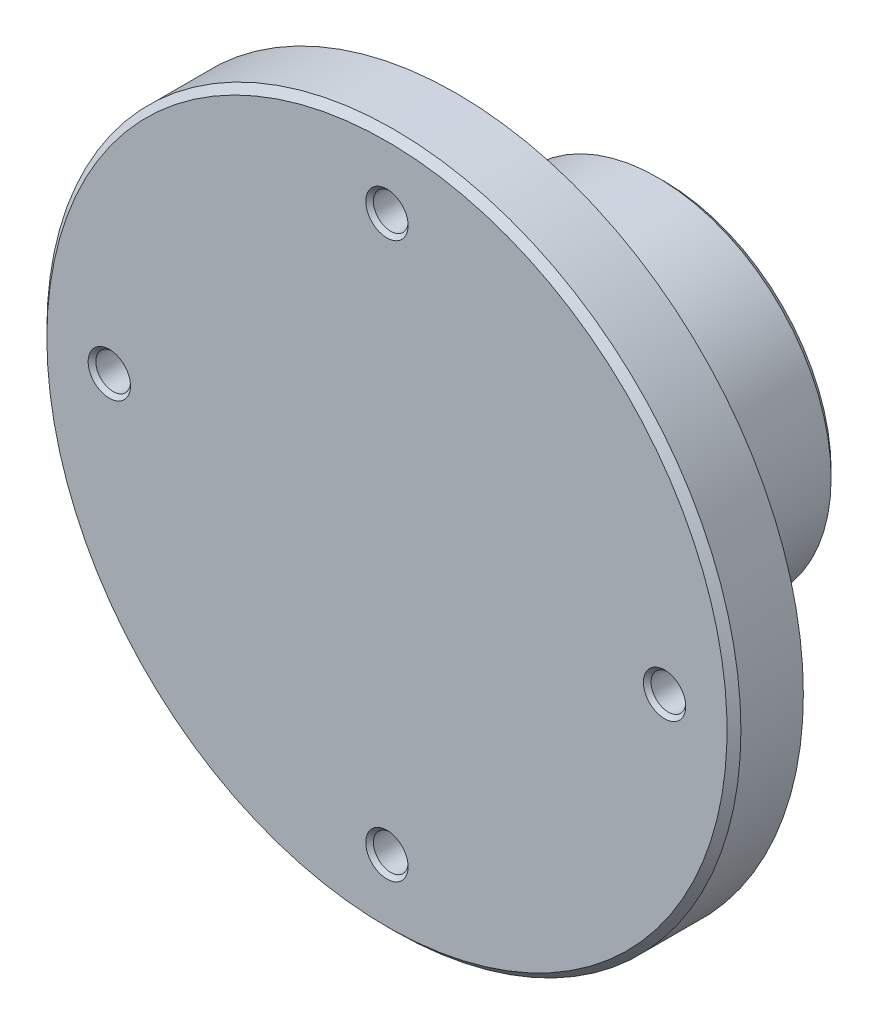
ISO-10303-21;
HEADER;
FILE_DESCRIPTION(('STEP AP214'),'2;1');
FILE_NAME('part.step','',(''),(''),'','','');
FILE_SCHEMA(('AUTOMOTIVE_DESIGN { 1 0 10303 214 1 1 1 1 }'));
ENDSEC;
DATA;
#1=APPLICATION_CONTEXT('core data for automotive mechanical design processes');
#2=APPLICATION_PROTOCOL_DEFINITION('international standard','automotive_design',2000,#1);
#3=PRODUCT_CONTEXT('',#1,'mechanical');
#4=PRODUCT('Part','Part','',(#3));
#5=PRODUCT_RELATED_PRODUCT_CATEGORY('part','',(#4));
#6=PRODUCT_DEFINITION_FORMATION('','',#4);
#7=PRODUCT_DEFINITION_CONTEXT('part definition',#1,'design');
#8=PRODUCT_DEFINITION('design','',#6,#7);
#9=PRODUCT_DEFINITION_SHAPE('','',#8);
#10=(LENGTH_UNIT() NAMED_UNIT(*) SI_UNIT(.MILLI.,.METRE.));
#11=(NAMED_UNIT(*) PLANE_ANGLE_UNIT() SI_UNIT($,.RADIAN.));
#12=(NAMED_UNIT(*) SI_UNIT($,.STERADIAN.) SOLID_ANGLE_UNIT());
#13=UNCERTAINTY_MEASURE_WITH_UNIT(LENGTH_MEASURE(1.E-05),#10,'distance_accuracy_value','');
#14=(GEOMETRIC_REPRESENTATION_CONTEXT(3) GLOBAL_UNCERTAINTY_ASSIGNED_CONTEXT((#13)) GLOBAL_UNIT_ASSIGNED_CONTEXT((#10,
#11,#12)) REPRESENTATION_CONTEXT('',''));
#15=CARTESIAN_POINT('',(0.,0.,0.));
#16=DIRECTION('',(0.,0.,1.));
#17=DIRECTION('',(1.,0.,0.));
#18=AXIS2_PLACEMENT_3D('',#15,#16,#17);
#19=CARTESIAN_POINT('',(0.,0.,0.));
#20=DIRECTION('',(0.,0.,-1.));
#21=DIRECTION('',(-1.,0.,0.));
#22=AXIS2_PLACEMENT_3D('',#19,#20,#21);
#23=PLANE('',#22);
#24=CARTESIAN_POINT('',(0.,0.,0.));
#25=DIRECTION('',(0.,0.,-1.));
#26=DIRECTION('',(-1.,0.,0.));
#27=AXIS2_PLACEMENT_3D('',#24,#25,#26);
#28=CIRCLE('',#27,24.5);
#29=CARTESIAN_POINT('',(-24.5,0.,0.));
#30=VERTEX_POINT('',#29);
#31=EDGE_CURVE('E73',#30,#30,#28,.F.);
#32=ORIENTED_EDGE('',*,*,#31,.T.);
#33=EDGE_LOOP('',(#32));
#34=FACE_BOUND('',#33,.T.);
#35=CARTESIAN_POINT('',(-20.,0.,0.));
#36=DIRECTION('',(0.,0.,1.));
#37=DIRECTION('',(1.,0.,0.));
#38=AXIS2_PLACEMENT_3D('',#35,#36,#37);
#39=CIRCLE('',#38,1.525);
#40=CARTESIAN_POINT('',(-18.475,0.,0.));
#41=VERTEX_POINT('',#40);
#42=EDGE_CURVE('E191',#41,#41,#39,.T.);
#43=ORIENTED_EDGE('',*,*,#42,.F.);
#44=EDGE_LOOP('',(#43));
#45=FACE_BOUND('',#44,.T.);
#46=CARTESIAN_POINT('',(0.,20.,0.));
#47=DIRECTION('',(0.,0.,1.));
#48=DIRECTION('',(1.,0.,0.));
#49=AXIS2_PLACEMENT_3D('',#46,#47,#48);
#50=CIRCLE('',#49,1.525);
#51=CARTESIAN_POINT('',(1.525,20.,0.));
#52=VERTEX_POINT('',#51);
#53=EDGE_CURVE('E91',#52,#52,#50,.T.);
#54=ORIENTED_EDGE('',*,*,#53,.F.);
#55=EDGE_LOOP('',(#54));
#56=FACE_BOUND('',#55,.T.);
#57=CARTESIAN_POINT('',(20.,0.,0.));
#58=DIRECTION('',(0.,0.,1.));
#59=DIRECTION('',(1.,0.,0.));
#60=AXIS2_PLACEMENT_3D('',#57,#58,#59);
#61=CIRCLE('',#60,1.525);
#62=CARTESIAN_POINT('',(21.525,0.,0.));
#63=VERTEX_POINT('',#62);
#64=EDGE_CURVE('E86',#63,#63,#61,.T.);
#65=ORIENTED_EDGE('',*,*,#64,.F.);
#66=EDGE_LOOP('',(#65));
#67=FACE_BOUND('',#66,.T.);
#68=CARTESIAN_POINT('',(0.,-20.,0.));
#69=DIRECTION('',(0.,0.,1.));
#70=DIRECTION('',(1.,0.,0.));
#71=AXIS2_PLACEMENT_3D('',#68,#69,#70);
#72=CIRCLE('',#71,1.525);
#73=CARTESIAN_POINT('',(1.525,-20.,0.));
#74=VERTEX_POINT('',#73);
#75=EDGE_CURVE('E81',#74,#74,#72,.T.);
#76=ORIENTED_EDGE('',*,*,#75,.F.);
#77=EDGE_LOOP('',(#76));
#78=FACE_BOUND('',#77,.T.);
#79=ADVANCED_FACE('F37',(#34,#45,#56,#67,#78),#23,.F.);
#80=CARTESIAN_POINT('',(0.,0.,109.859154929577));
#81=DIRECTION('',(0.,0.,1.));
#82=DIRECTION('',(1.,0.,0.));
#83=AXIS2_PLACEMENT_3D('',#80,#81,#82);
#84=CYLINDRICAL_SURFACE('',#83,25.);
#85=CARTESIAN_POINT('',(0.,0.,-0.500000000000028));
#86=DIRECTION('',(0.,0.,-1.));
#87=DIRECTION('',(-1.,0.,0.));
#88=AXIS2_PLACEMENT_3D('',#85,#86,#87);
#89=CIRCLE('',#88,25.);
#90=CARTESIAN_POINT('',(-25.,0.,-0.500000000000028));
#91=VERTEX_POINT('',#90);
#92=EDGE_CURVE('E95',#91,#91,#89,.T.);
#93=ORIENTED_EDGE('',*,*,#92,.T.);
#94=EDGE_LOOP('',(#93));
#95=FACE_BOUND('',#94,.T.);
#96=CARTESIAN_POINT('',(0.,0.,-5.));
#97=DIRECTION('',(0.,0.,1.));
#98=DIRECTION('',(1.,0.,0.));
#99=AXIS2_PLACEMENT_3D('',#96,#97,#98);
#100=CIRCLE('',#99,25.);
#101=CARTESIAN_POINT('',(25.,0.,-5.));
#102=VERTEX_POINT('',#101);
#103=EDGE_CURVE('E57',#102,#102,#100,.T.);
#104=ORIENTED_EDGE('',*,*,#103,.T.);
#105=EDGE_LOOP('',(#104));
#106=FACE_BOUND('',#105,.T.);
#107=ADVANCED_FACE('F113',(#95,#106),#84,.T.);
#108=CARTESIAN_POINT('',(0.,25.,-5.));
#109=DIRECTION('',(0.,0.,1.));
#110=DIRECTION('',(1.,0.,0.));
#111=AXIS2_PLACEMENT_3D('',#108,#109,#110);
#112=PLANE('',#111);
#113=CARTESIAN_POINT('',(-20.,0.,-5.));
#114=DIRECTION('',(0.,0.,1.));
#115=DIRECTION('',(1.,0.,0.));
#116=AXIS2_PLACEMENT_3D('',#113,#114,#115);
#117=CIRCLE('',#116,1.25);
#118=CARTESIAN_POINT('',(-18.75,0.,-5.));
#119=VERTEX_POINT('',#118);
#120=EDGE_CURVE('E88',#119,#119,#117,.T.);
#121=ORIENTED_EDGE('',*,*,#120,.T.);
#122=EDGE_LOOP('',(#121));
#123=FACE_BOUND('',#122,.T.);
#124=CARTESIAN_POINT('',(0.,20.,-5.));
#125=DIRECTION('',(0.,0.,1.));
#126=DIRECTION('',(1.,0.,0.));
#127=AXIS2_PLACEMENT_3D('',#124,#125,#126);
#128=CIRCLE('',#127,1.25);
#129=CARTESIAN_POINT('',(1.25,20.,-5.));
#130=VERTEX_POINT('',#129);
#131=EDGE_CURVE('E83',#130,#130,#128,.T.);
#132=ORIENTED_EDGE('',*,*,#131,.T.);
#133=EDGE_LOOP('',(#132));
#134=FACE_BOUND('',#133,.T.);
#135=CARTESIAN_POINT('',(20.,0.,-5.));
#136=DIRECTION('',(0.,0.,1.));
#137=DIRECTION('',(1.,0.,0.));
#138=AXIS2_PLACEMENT_3D('',#135,#136,#137);
#139=CIRCLE('',#138,1.25);
#140=CARTESIAN_POINT('',(21.25,0.,-5.));
#141=VERTEX_POINT('',#140);
#142=EDGE_CURVE('E78',#141,#141,#139,.T.);
#143=ORIENTED_EDGE('',*,*,#142,.T.);
#144=EDGE_LOOP('',(#143));
#145=FACE_BOUND('',#144,.T.);
#146=CARTESIAN_POINT('',(0.,-20.,-5.));
#147=DIRECTION('',(0.,0.,1.));
#148=DIRECTION('',(1.,0.,0.));
#149=AXIS2_PLACEMENT_3D('',#146,#147,#148);
#150=CIRCLE('',#149,1.25);
#151=CARTESIAN_POINT('',(1.25,-20.,-5.));
#152=VERTEX_POINT('',#151);
#153=EDGE_CURVE('E74',#152,#152,#150,.T.);
#154=ORIENTED_EDGE('',*,*,#153,.T.);
#155=EDGE_LOOP('',(#154));
#156=FACE_BOUND('',#155,.T.);
#157=CARTESIAN_POINT('',(0.,0.,-5.));
#158=DIRECTION('',(0.,0.,1.));
#159=DIRECTION('',(1.,0.,0.));
#160=AXIS2_PLACEMENT_3D('',#157,#158,#159);
#161=CIRCLE('',#160,15.5);
#162=CARTESIAN_POINT('',(15.5,0.,-5.));
#163=VERTEX_POINT('',#162);
#164=EDGE_CURVE('E61',#163,#163,#161,.T.);
#165=ORIENTED_EDGE('',*,*,#164,.T.);
#166=EDGE_LOOP('',(#165));
#167=FACE_BOUND('',#166,.T.);
#168=ORIENTED_EDGE('',*,*,#103,.F.);
#169=EDGE_LOOP('',(#168));
#170=FACE_BOUND('',#169,.T.);
#171=ADVANCED_FACE('F119',(#123,#134,#145,#156,#167,#170),#112,.F.);
#172=CARTESIAN_POINT('',(0.,0.,109.859154929577));
#173=DIRECTION('',(0.,0.,1.));
#174=DIRECTION('',(1.,0.,0.));
#175=AXIS2_PLACEMENT_3D('',#172,#173,#174);
#176=CYLINDRICAL_SURFACE('',#175,12.5);
#177=CARTESIAN_POINT('',(0.,0.,-19.5));
#178=DIRECTION('',(0.,0.,1.));
#179=DIRECTION('',(1.,0.,0.));
#180=AXIS2_PLACEMENT_3D('',#177,#178,#179);
#181=CIRCLE('',#180,12.5);
#182=CARTESIAN_POINT('',(12.5,0.,-19.5));
#183=VERTEX_POINT('',#182);
#184=EDGE_CURVE('E44',#183,#183,#181,.T.);
#185=ORIENTED_EDGE('',*,*,#184,.T.);
#186=EDGE_LOOP('',(#185));
#187=FACE_BOUND('',#186,.T.);
#188=CARTESIAN_POINT('',(0.,0.,-7.99999999999998));
#189=DIRECTION('',(0.,0.,1.));
#190=DIRECTION('',(1.,0.,0.));
#191=AXIS2_PLACEMENT_3D('',#188,#189,#190);
#192=CIRCLE('',#191,12.5);
#193=CARTESIAN_POINT('',(12.5,0.,-7.99999999999998));
#194=VERTEX_POINT('',#193);
#195=EDGE_CURVE('E70',#194,#194,#192,.F.);
#196=ORIENTED_EDGE('',*,*,#195,.T.);
#197=EDGE_LOOP('',(#196));
#198=FACE_BOUND('',#197,.T.);
#199=ADVANCED_FACE('F100',(#187,#198),#176,.T.);
#200=CARTESIAN_POINT('',(0.,12.5,-20.));
#201=DIRECTION('',(0.,0.,1.));
#202=DIRECTION('',(1.,0.,0.));
#203=AXIS2_PLACEMENT_3D('',#200,#201,#202);
#204=PLANE('',#203);
#205=CARTESIAN_POINT('',(0.,0.,-20.));
#206=DIRECTION('',(0.,0.,1.));
#207=DIRECTION('',(1.,0.,0.));
#208=AXIS2_PLACEMENT_3D('',#205,#206,#207);
#209=CIRCLE('',#208,12.);
#210=CARTESIAN_POINT('',(12.,0.,-20.));
#211=VERTEX_POINT('',#210);
#212=EDGE_CURVE('E11',#211,#211,#209,.F.);
#213=ORIENTED_EDGE('',*,*,#212,.T.);
#214=EDGE_LOOP('',(#213));
#215=FACE_BOUND('',#214,.T.);
#216=CARTESIAN_POINT('',(0.,0.,-20.));
#217=DIRECTION('',(0.,0.,-1.));
#218=DIRECTION('',(-1.,0.,0.));
#219=AXIS2_PLACEMENT_3D('',#216,#217,#218);
#220=CIRCLE('',#219,5.025);
#221=CARTESIAN_POINT('',(-5.025,0.,-20.));
#222=VERTEX_POINT('',#221);
#223=EDGE_CURVE('E64',#222,#222,#220,.T.);
#224=ORIENTED_EDGE('',*,*,#223,.F.);
#225=EDGE_LOOP('',(#224));
#226=FACE_BOUND('',#225,.T.);
#227=ADVANCED_FACE('F51',(#215,#226),#204,.F.);
#228=CARTESIAN_POINT('',(0.,0.,-8.));
#229=DIRECTION('',(0.,0.,-1.));
#230=DIRECTION('',(-1.,0.,0.));
#231=AXIS2_PLACEMENT_3D('',#228,#229,#230);
#232=CONICAL_SURFACE('',#231,4.25,1.02974425867665);
#233=CARTESIAN_POINT('',(0.,0.,-5.44634236913287));
#234=VERTEX_POINT('',#233);
#235=VERTEX_LOOP('',#234);
#236=FACE_BOUND('',#235,.T.);
#237=CARTESIAN_POINT('',(0.,0.,-8.));
#238=DIRECTION('',(0.,0.,-1.));
#239=DIRECTION('',(-1.,0.,0.));
#240=AXIS2_PLACEMENT_3D('',#237,#238,#239);
#241=CIRCLE('',#240,4.25);
#242=CARTESIAN_POINT('',(-4.25,0.,-8.));
#243=VERTEX_POINT('',#242);
#244=EDGE_CURVE('E55',#243,#243,#241,.T.);
#245=ORIENTED_EDGE('',*,*,#244,.T.);
#246=EDGE_LOOP('',(#245));
#247=FACE_BOUND('',#246,.T.);
#248=ADVANCED_FACE('F47',(#236,#247),#232,.F.);
#249=CARTESIAN_POINT('',(0.,0.,-20.));
#250=DIRECTION('',(0.,0.,-1.));
#251=DIRECTION('',(-1.,0.,0.));
#252=AXIS2_PLACEMENT_3D('',#249,#250,#251);
#253=CYLINDRICAL_SURFACE('',#252,4.25);
#254=ORIENTED_EDGE('',*,*,#244,.F.);
#255=EDGE_LOOP('',(#254));
#256=FACE_BOUND('',#255,.T.);
#257=CARTESIAN_POINT('',(0.,0.,-19.225));
#258=DIRECTION('',(0.,0.,-1.));
#259=DIRECTION('',(-1.,0.,0.));
#260=AXIS2_PLACEMENT_3D('',#257,#258,#259);
#261=CIRCLE('',#260,4.25);
#262=CARTESIAN_POINT('',(-4.25,0.,-19.225));
#263=VERTEX_POINT('',#262);
#264=EDGE_CURVE('E58',#263,#263,#261,.T.);
#265=ORIENTED_EDGE('',*,*,#264,.T.);
#266=EDGE_LOOP('',(#265));
#267=FACE_BOUND('',#266,.T.);
#268=ADVANCED_FACE('F50',(#256,#267),#253,.F.);
#269=CARTESIAN_POINT('',(0.,0.,-20.));
#270=DIRECTION('',(0.,0.,-1.));
#271=DIRECTION('',(-1.,0.,0.));
#272=AXIS2_PLACEMENT_3D('',#269,#270,#271);
#273=CONICAL_SURFACE('',#272,5.025,0.785398163397449);
#274=ORIENTED_EDGE('',*,*,#264,.F.);
#275=EDGE_LOOP('',(#274));
#276=FACE_BOUND('',#275,.T.);
#277=ORIENTED_EDGE('',*,*,#223,.T.);
#278=EDGE_LOOP('',(#277));
#279=FACE_BOUND('',#278,.T.);
#280=ADVANCED_FACE('F128',(#276,#279),#273,.F.);
#281=CARTESIAN_POINT('',(0.,0.,-5.));
#282=DIRECTION('',(0.,0.,1.));
#283=DIRECTION('',(1.,0.,0.));
#284=AXIS2_PLACEMENT_3D('',#281,#282,#283);
#285=CONICAL_SURFACE('',#284,15.5,0.785398163397453);
#286=CARTESIAN_POINT('',(12.5,0.,-7.99999999999998));
#287=CARTESIAN_POINT('',(12.53125,0.,-7.96874999999998));
#288=CARTESIAN_POINT('',(12.5625,0.,-7.93749999999998));
#289=CARTESIAN_POINT('',(12.625,0.,-7.87499999999998));
#290=CARTESIAN_POINT('',(12.65625,0.,-7.84374999999998));
#291=CARTESIAN_POINT('',(12.71875,0.,-7.78124999999998));
#292=CARTESIAN_POINT('',(12.75,0.,-7.74999999999998));
#293=CARTESIAN_POINT('',(12.8125,0.,-7.68749999999998));
#294=CARTESIAN_POINT('',(12.84375,0.,-7.65624999999998));
#295=CARTESIAN_POINT('',(12.90625,0.,-7.59374999999998));
#296=CARTESIAN_POINT('',(12.9375,0.,-7.56249999999998));
#297=CARTESIAN_POINT('',(13.,0.,-7.49999999999998));
#298=CARTESIAN_POINT('',(13.03125,0.,-7.46874999999998));
#299=CARTESIAN_POINT('',(13.09375,0.,-7.40624999999998));
#300=CARTESIAN_POINT('',(13.125,0.,-7.37499999999998));
#301=CARTESIAN_POINT('',(13.1875,0.,-7.31249999999999));
#302=CARTESIAN_POINT('',(13.21875,0.,-7.28124999999999));
#303=CARTESIAN_POINT('',(13.28125,0.,-7.21874999999999));
#304=CARTESIAN_POINT('',(13.3125,0.,-7.18749999999999));
#305=CARTESIAN_POINT('',(13.375,0.,-7.12499999999999));
#306=CARTESIAN_POINT('',(13.40625,0.,-7.09374999999999));
#307=CARTESIAN_POINT('',(13.46875,0.,-7.03124999999999));
#308=CARTESIAN_POINT('',(13.5,0.,-6.99999999999999));
#309=CARTESIAN_POINT('',(13.5625,0.,-6.93749999999999));
#310=CARTESIAN_POINT('',(13.59375,0.,-6.90624999999999));
#311=CARTESIAN_POINT('',(13.65625,0.,-6.84374999999999));
#312=CARTESIAN_POINT('',(13.6875,0.,-6.81249999999999));
#313=CARTESIAN_POINT('',(13.75,0.,-6.74999999999999));
#314=CARTESIAN_POINT('',(13.78125,0.,-6.71874999999999));
#315=CARTESIAN_POINT('',(13.84375,0.,-6.65624999999999));
#316=CARTESIAN_POINT('',(13.875,0.,-6.62499999999999));
#317=CARTESIAN_POINT('',(13.9375,0.,-6.56249999999999));
#318=CARTESIAN_POINT('',(13.96875,0.,-6.53124999999999));
#319=CARTESIAN_POINT('',(14.03125,0.,-6.46874999999999));
#320=CARTESIAN_POINT('',(14.0625,0.,-6.43749999999999));
#321=CARTESIAN_POINT('',(14.125,0.,-6.37499999999999));
#322=CARTESIAN_POINT('',(14.15625,0.,-6.34374999999999));
#323=CARTESIAN_POINT('',(14.21875,0.,-6.28124999999999));
#324=CARTESIAN_POINT('',(14.25,0.,-6.24999999999999));
#325=CARTESIAN_POINT('',(14.3125,0.,-6.18749999999999));
#326=CARTESIAN_POINT('',(14.34375,0.,-6.15624999999999));
#327=CARTESIAN_POINT('',(14.40625,0.,-6.09374999999999));
#328=CARTESIAN_POINT('',(14.4375,0.,-6.06249999999999));
#329=CARTESIAN_POINT('',(14.5,0.,-5.99999999999999));
#330=CARTESIAN_POINT('',(14.53125,0.,-5.96874999999999));
#331=CARTESIAN_POINT('',(14.59375,0.,-5.90624999999999));
#332=CARTESIAN_POINT('',(14.625,0.,-5.875));
#333=CARTESIAN_POINT('',(14.6875,0.,-5.8125));
#334=CARTESIAN_POINT('',(14.71875,0.,-5.78125));
#335=CARTESIAN_POINT('',(14.78125,0.,-5.71875));
#336=CARTESIAN_POINT('',(14.8125,0.,-5.6875));
#337=CARTESIAN_POINT('',(14.875,0.,-5.625));
#338=CARTESIAN_POINT('',(14.90625,0.,-5.59375));
#339=CARTESIAN_POINT('',(14.96875,0.,-5.53125));
#340=CARTESIAN_POINT('',(15.,0.,-5.5));
#341=CARTESIAN_POINT('',(15.0625,0.,-5.4375));
#342=CARTESIAN_POINT('',(15.09375,0.,-5.40625));
#343=CARTESIAN_POINT('',(15.15625,0.,-5.34375));
#344=CARTESIAN_POINT('',(15.1875,0.,-5.3125));
#345=CARTESIAN_POINT('',(15.25,0.,-5.25));
#346=CARTESIAN_POINT('',(15.28125,0.,-5.21875));
#347=CARTESIAN_POINT('',(15.34375,0.,-5.15625));
#348=CARTESIAN_POINT('',(15.375,0.,-5.125));
#349=CARTESIAN_POINT('',(15.4375,0.,-5.0625));
#350=CARTESIAN_POINT('',(15.46875,0.,-5.03125));
#351=CARTESIAN_POINT('',(15.5,0.,-5.));
#352=B_SPLINE_CURVE_WITH_KNOTS('',3,(#286,#287,#288,#289,#290,#291,#292,#293,#294,#295,#296,
#297,#298,#299,#300,#301,#302,#303,#304,#305,#306,#307,#308,#309,#310,#311,#312,#313,#314,#315,
#316,#317,#318,#319,#320,#321,#322,#323,#324,#325,#326,#327,#328,#329,#330,#331,#332,#333,#334,
#335,#336,#337,#338,#339,#340,#341,#342,#343,#344,#345,#346,#347,#348,#349,#350,#351),
.UNSPECIFIED.,.F.,.F.,(4,2,2,2,2,2,2,2,2,2,2,2,2,2,2,2,2,2,2,2,2,2,2,2,2,2,2,2,2,2,2,2,4),(0.,
0.132582521472478,0.265165042944956,0.397747564417433,0.530330085889911,0.662912607362388,
0.795495128834866,0.928077650307342,1.06066017177982,1.1932426932523,1.32582521472477,
1.45840773619725,1.59099025766973,1.72357277914221,1.85615530061468,1.98873782208716,
2.12132034355964,2.25390286503212,2.38648538650459,2.51906790797707,2.65165042944955,
2.78423295092203,2.9168154723945,3.04939799386698,3.18198051533946,3.31456303681194,
3.44714555828441,3.57972807975689,3.71231060122937,3.84489312270184,3.97747564417432,
4.1100581656468,4.24264068711928),.UNSPECIFIED.);
#353=EDGE_CURVE('BSEAM125',#194,#163,#352,.T.);
#354=ORIENTED_EDGE('',*,*,#195,.F.);
#355=ORIENTED_EDGE('',*,*,#164,.F.);
#356=ORIENTED_EDGE('',*,*,#353,.T.);
#357=ORIENTED_EDGE('',*,*,#353,.F.);
#358=EDGE_LOOP('',(#354,#356,#355,#357));
#359=FACE_BOUND('',#358,.T.);
#360=ADVANCED_FACE('F125',(#359),#285,.T.);
#361=CARTESIAN_POINT('',(0.,-20.,0.));
#362=DIRECTION('',(0.,0.,1.));
#363=DIRECTION('',(1.,0.,0.));
#364=AXIS2_PLACEMENT_3D('',#361,#362,#363);
#365=CYLINDRICAL_SURFACE('',#364,1.25);
#366=CARTESIAN_POINT('',(0.,-20.,-0.275000000000004));
#367=DIRECTION('',(0.,0.,1.));
#368=DIRECTION('',(1.,0.,0.));
#369=AXIS2_PLACEMENT_3D('',#366,#367,#368);
#370=CIRCLE('',#369,1.25);
#371=CARTESIAN_POINT('',(1.25,-20.,-0.275000000000004));
#372=VERTEX_POINT('',#371);
#373=EDGE_CURVE('E77',#372,#372,#370,.T.);
#374=ORIENTED_EDGE('',*,*,#373,.T.);
#375=EDGE_LOOP('',(#374));
#376=FACE_BOUND('',#375,.T.);
#377=ORIENTED_EDGE('',*,*,#153,.F.);
#378=EDGE_LOOP('',(#377));
#379=FACE_BOUND('',#378,.T.);
#380=ADVANCED_FACE('F127',(#376,#379),#365,.F.);
#381=CARTESIAN_POINT('',(0.,-20.,0.));
#382=DIRECTION('',(0.,0.,1.));
#383=DIRECTION('',(1.,0.,0.));
#384=AXIS2_PLACEMENT_3D('',#381,#382,#383);
#385=CONICAL_SURFACE('',#384,1.525,0.785398163397443);
#386=ORIENTED_EDGE('',*,*,#373,.F.);
#387=EDGE_LOOP('',(#386));
#388=FACE_BOUND('',#387,.T.);
#389=ORIENTED_EDGE('',*,*,#75,.T.);
#390=EDGE_LOOP('',(#389));
#391=FACE_BOUND('',#390,.T.);
#392=ADVANCED_FACE('F134',(#388,#391),#385,.F.);
#393=CARTESIAN_POINT('',(20.,0.,0.));
#394=DIRECTION('',(0.,0.,1.));
#395=DIRECTION('',(1.,0.,0.));
#396=AXIS2_PLACEMENT_3D('',#393,#394,#395);
#397=CYLINDRICAL_SURFACE('',#396,1.25);
#398=CARTESIAN_POINT('',(20.,0.,-0.275000000000004));
#399=DIRECTION('',(0.,0.,1.));
#400=DIRECTION('',(1.,0.,0.));
#401=AXIS2_PLACEMENT_3D('',#398,#399,#400);
#402=CIRCLE('',#401,1.25);
#403=CARTESIAN_POINT('',(21.25,0.,-0.275000000000004));
#404=VERTEX_POINT('',#403);
#405=EDGE_CURVE('E82',#404,#404,#402,.T.);
#406=ORIENTED_EDGE('',*,*,#405,.T.);
#407=EDGE_LOOP('',(#406));
#408=FACE_BOUND('',#407,.T.);
#409=ORIENTED_EDGE('',*,*,#142,.F.);
#410=EDGE_LOOP('',(#409));
#411=FACE_BOUND('',#410,.T.);
#412=ADVANCED_FACE('F161',(#408,#411),#397,.F.);
#413=CARTESIAN_POINT('',(20.,0.,0.));
#414=DIRECTION('',(0.,0.,1.));
#415=DIRECTION('',(1.,0.,0.));
#416=AXIS2_PLACEMENT_3D('',#413,#414,#415);
#417=CONICAL_SURFACE('',#416,1.525,0.785398163397444);
#418=ORIENTED_EDGE('',*,*,#405,.F.);
#419=EDGE_LOOP('',(#418));
#420=FACE_BOUND('',#419,.T.);
#421=ORIENTED_EDGE('',*,*,#64,.T.);
#422=EDGE_LOOP('',(#421));
#423=FACE_BOUND('',#422,.T.);
#424=ADVANCED_FACE('F165',(#420,#423),#417,.F.);
#425=CARTESIAN_POINT('',(0.,20.,0.));
#426=DIRECTION('',(0.,0.,1.));
#427=DIRECTION('',(1.,0.,0.));
#428=AXIS2_PLACEMENT_3D('',#425,#426,#427);
#429=CYLINDRICAL_SURFACE('',#428,1.25);
#430=CARTESIAN_POINT('',(0.,20.,-0.275000000000004));
#431=DIRECTION('',(0.,0.,1.));
#432=DIRECTION('',(1.,0.,0.));
#433=AXIS2_PLACEMENT_3D('',#430,#431,#432);
#434=CIRCLE('',#433,1.25);
#435=CARTESIAN_POINT('',(1.25,20.,-0.275000000000004));
#436=VERTEX_POINT('',#435);
#437=EDGE_CURVE('E87',#436,#436,#434,.T.);
#438=ORIENTED_EDGE('',*,*,#437,.T.);
#439=EDGE_LOOP('',(#438));
#440=FACE_BOUND('',#439,.T.);
#441=ORIENTED_EDGE('',*,*,#131,.F.);
#442=EDGE_LOOP('',(#441));
#443=FACE_BOUND('',#442,.T.);
#444=ADVANCED_FACE('F169',(#440,#443),#429,.F.);
#445=CARTESIAN_POINT('',(0.,20.,0.));
#446=DIRECTION('',(0.,0.,1.));
#447=DIRECTION('',(1.,0.,0.));
#448=AXIS2_PLACEMENT_3D('',#445,#446,#447);
#449=CONICAL_SURFACE('',#448,1.525,0.785398163397443);
#450=ORIENTED_EDGE('',*,*,#437,.F.);
#451=EDGE_LOOP('',(#450));
#452=FACE_BOUND('',#451,.T.);
#453=ORIENTED_EDGE('',*,*,#53,.T.);
#454=EDGE_LOOP('',(#453));
#455=FACE_BOUND('',#454,.T.);
#456=ADVANCED_FACE('F173',(#452,#455),#449,.F.);
#457=CARTESIAN_POINT('',(-20.,0.,0.));
#458=DIRECTION('',(0.,0.,1.));
#459=DIRECTION('',(1.,0.,0.));
#460=AXIS2_PLACEMENT_3D('',#457,#458,#459);
#461=CYLINDRICAL_SURFACE('',#460,1.25);
#462=CARTESIAN_POINT('',(-20.,0.,-0.275000000000004));
#463=DIRECTION('',(0.,0.,1.));
#464=DIRECTION('',(1.,0.,0.));
#465=AXIS2_PLACEMENT_3D('',#462,#463,#464);
#466=CIRCLE('',#465,1.25);
#467=CARTESIAN_POINT('',(-18.75,0.,-0.275000000000004));
#468=VERTEX_POINT('',#467);
#469=EDGE_CURVE('E92',#468,#468,#466,.T.);
#470=ORIENTED_EDGE('',*,*,#469,.T.);
#471=EDGE_LOOP('',(#470));
#472=FACE_BOUND('',#471,.T.);
#473=ORIENTED_EDGE('',*,*,#120,.F.);
#474=EDGE_LOOP('',(#473));
#475=FACE_BOUND('',#474,.T.);
#476=ADVANCED_FACE('F177',(#472,#475),#461,.F.);
#477=CARTESIAN_POINT('',(-20.,0.,0.));
#478=DIRECTION('',(0.,0.,1.));
#479=DIRECTION('',(1.,0.,0.));
#480=AXIS2_PLACEMENT_3D('',#477,#478,#479);
#481=CONICAL_SURFACE('',#480,1.525,0.785398163397444);
#482=ORIENTED_EDGE('',*,*,#469,.F.);
#483=EDGE_LOOP('',(#482));
#484=FACE_BOUND('',#483,.T.);
#485=ORIENTED_EDGE('',*,*,#42,.T.);
#486=EDGE_LOOP('',(#485));
#487=FACE_BOUND('',#486,.T.);
#488=ADVANCED_FACE('F109',(#484,#487),#481,.F.);
#489=CARTESIAN_POINT('',(0.,0.,0.));
#490=DIRECTION('',(0.,0.,-1.));
#491=DIRECTION('',(-1.,0.,0.));
#492=AXIS2_PLACEMENT_3D('',#489,#490,#491);
#493=CONICAL_SURFACE('',#492,24.5,0.785398163397438);
#494=ORIENTED_EDGE('',*,*,#92,.F.);
#495=EDGE_LOOP('',(#494));
#496=FACE_BOUND('',#495,.T.);
#497=ORIENTED_EDGE('',*,*,#31,.F.);
#498=EDGE_LOOP('',(#497));
#499=FACE_BOUND('',#498,.T.);
#500=ADVANCED_FACE('F104',(#496,#499),#493,.T.);
#501=CARTESIAN_POINT('',(0.,0.,-19.5));
#502=DIRECTION('',(0.,0.,1.));
#503=DIRECTION('',(1.,0.,0.));
#504=AXIS2_PLACEMENT_3D('',#501,#502,#503);
#505=CONICAL_SURFACE('',#504,12.5,0.785398163397454);
#506=ORIENTED_EDGE('',*,*,#212,.F.);
#507=EDGE_LOOP('',(#506));
#508=FACE_BOUND('',#507,.T.);
#509=ORIENTED_EDGE('',*,*,#184,.F.);
#510=EDGE_LOOP('',(#509));
#511=FACE_BOUND('',#510,.T.);
#512=ADVANCED_FACE('F39',(#508,#511),#505,.T.);
#513=CLOSED_SHELL('',(#79,#107,#171,#199,#227,#248,#268,#280,#360,#380,#392,#412,#424,#444,#456,
#476,#488,#500,#512));
#514=MANIFOLD_SOLID_BREP('B2',#513);
#515=ADVANCED_BREP_SHAPE_REPRESENTATION('',(#18,#514),#14);
#516=SHAPE_DEFINITION_REPRESENTATION(#9,#515);
ENDSEC;
END-ISO-10303-21;
